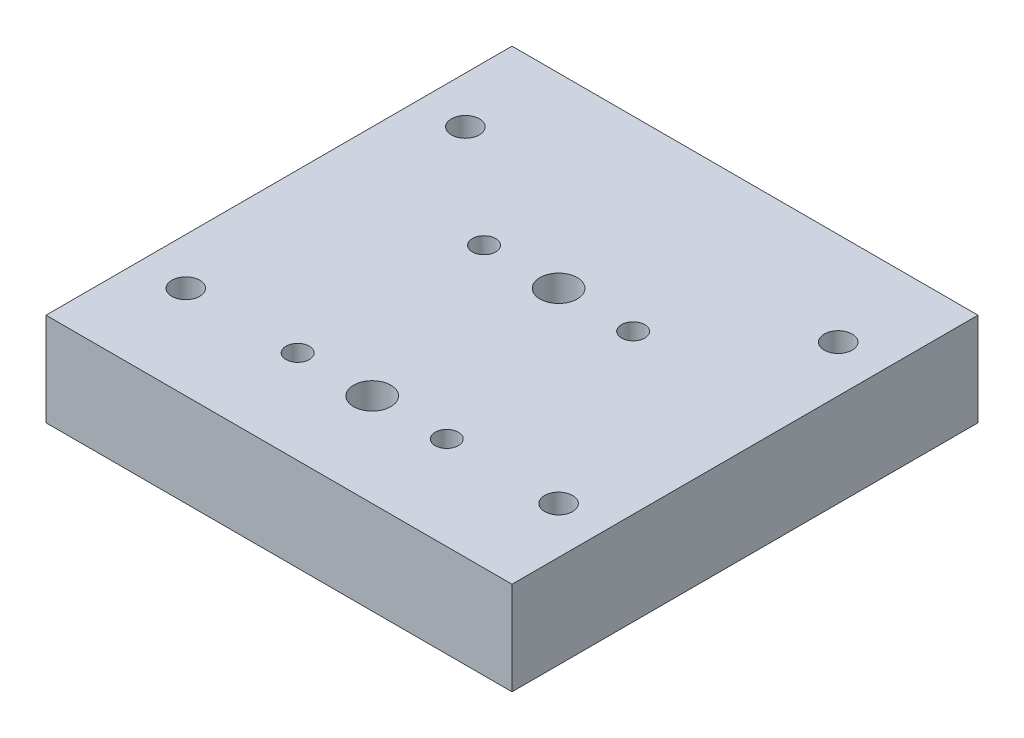
ISO-10303-21;
HEADER;
FILE_DESCRIPTION(('STEP AP214'),'2;1');
FILE_NAME('part.step','',(''),(''),'','','');
FILE_SCHEMA(('AUTOMOTIVE_DESIGN { 1 0 10303 214 1 1 1 1 }'));
ENDSEC;
DATA;
#1=APPLICATION_CONTEXT('core data for automotive mechanical design processes');
#2=APPLICATION_PROTOCOL_DEFINITION('international standard','automotive_design',2000,#1);
#3=PRODUCT_CONTEXT('',#1,'mechanical');
#4=PRODUCT('Part','Part','',(#3));
#5=PRODUCT_RELATED_PRODUCT_CATEGORY('part','',(#4));
#6=PRODUCT_DEFINITION_FORMATION('','',#4);
#7=PRODUCT_DEFINITION_CONTEXT('part definition',#1,'design');
#8=PRODUCT_DEFINITION('design','',#6,#7);
#9=PRODUCT_DEFINITION_SHAPE('','',#8);
#10=(LENGTH_UNIT() NAMED_UNIT(*) SI_UNIT(.MILLI.,.METRE.));
#11=(NAMED_UNIT(*) PLANE_ANGLE_UNIT() SI_UNIT($,.RADIAN.));
#12=(NAMED_UNIT(*) SI_UNIT($,.STERADIAN.) SOLID_ANGLE_UNIT());
#13=UNCERTAINTY_MEASURE_WITH_UNIT(LENGTH_MEASURE(1.E-05),#10,'distance_accuracy_value','');
#14=(GEOMETRIC_REPRESENTATION_CONTEXT(3) GLOBAL_UNCERTAINTY_ASSIGNED_CONTEXT((#13)) GLOBAL_UNIT_ASSIGNED_CONTEXT((#10,
#11,#12)) REPRESENTATION_CONTEXT('',''));
#15=CARTESIAN_POINT('',(0.,0.,0.));
#16=DIRECTION('',(0.,0.,1.));
#17=DIRECTION('',(1.,0.,0.));
#18=AXIS2_PLACEMENT_3D('',#15,#16,#17);
#19=CARTESIAN_POINT('',(0.,20.,0.));
#20=DIRECTION('',(1.,0.,0.));
#21=DIRECTION('',(0.,0.,-1.));
#22=AXIS2_PLACEMENT_3D('',#19,#20,#21);
#23=PLANE('',#22);
#24=DIRECTION('',(0.,0.,1.));
#25=VECTOR('',#24,1.);
#26=CARTESIAN_POINT('',(0.,0.,0.));
#27=LINE('',#26,#25);
#28=CARTESIAN_POINT('',(0.,0.,-100.));
#29=VERTEX_POINT('',#28);
#30=CARTESIAN_POINT('',(0.,0.,0.));
#31=VERTEX_POINT('',#30);
#32=EDGE_CURVE('E98',#29,#31,#27,.T.);
#33=ORIENTED_EDGE('',*,*,#32,.T.);
#34=DIRECTION('',(0.,-1.,0.));
#35=VECTOR('',#34,1.);
#36=CARTESIAN_POINT('',(0.,20.,0.));
#37=LINE('',#36,#35);
#38=CARTESIAN_POINT('',(0.,20.,0.));
#39=VERTEX_POINT('',#38);
#40=EDGE_CURVE('E11',#39,#31,#37,.T.);
#41=ORIENTED_EDGE('',*,*,#40,.F.);
#42=DIRECTION('',(0.,0.,1.));
#43=VECTOR('',#42,1.);
#44=CARTESIAN_POINT('',(0.,20.,0.));
#45=LINE('',#44,#43);
#46=CARTESIAN_POINT('',(0.,20.,-100.));
#47=VERTEX_POINT('',#46);
#48=EDGE_CURVE('E86',#47,#39,#45,.T.);
#49=ORIENTED_EDGE('',*,*,#48,.F.);
#50=DIRECTION('',(0.,-1.,0.));
#51=VECTOR('',#50,1.);
#52=CARTESIAN_POINT('',(0.,20.,-100.));
#53=LINE('',#52,#51);
#54=EDGE_CURVE('E94',#47,#29,#53,.T.);
#55=ORIENTED_EDGE('',*,*,#54,.T.);
#56=EDGE_LOOP('',(#33,#41,#49,#55));
#57=FACE_BOUND('',#56,.T.);
#58=ADVANCED_FACE('F35',(#57),#23,.F.);
#59=CARTESIAN_POINT('',(0.,20.,0.));
#60=DIRECTION('',(0.,0.,-1.));
#61=DIRECTION('',(-1.,0.,0.));
#62=AXIS2_PLACEMENT_3D('',#59,#60,#61);
#63=PLANE('',#62);
#64=DIRECTION('',(1.,0.,0.));
#65=VECTOR('',#64,1.);
#66=CARTESIAN_POINT('',(0.,0.,0.));
#67=LINE('',#66,#65);
#68=CARTESIAN_POINT('',(100.,0.,0.));
#69=VERTEX_POINT('',#68);
#70=EDGE_CURVE('E90',#31,#69,#67,.T.);
#71=ORIENTED_EDGE('',*,*,#70,.T.);
#72=DIRECTION('',(0.,-1.,0.));
#73=VECTOR('',#72,1.);
#74=CARTESIAN_POINT('',(100.,20.,0.));
#75=LINE('',#74,#73);
#76=CARTESIAN_POINT('',(100.,20.,0.));
#77=VERTEX_POINT('',#76);
#78=EDGE_CURVE('E43',#77,#69,#75,.T.);
#79=ORIENTED_EDGE('',*,*,#78,.F.);
#80=DIRECTION('',(1.,0.,0.));
#81=VECTOR('',#80,1.);
#82=CARTESIAN_POINT('',(0.,20.,0.));
#83=LINE('',#82,#81);
#84=EDGE_CURVE('E81',#39,#77,#83,.T.);
#85=ORIENTED_EDGE('',*,*,#84,.F.);
#86=ORIENTED_EDGE('',*,*,#40,.T.);
#87=EDGE_LOOP('',(#71,#79,#85,#86));
#88=FACE_BOUND('',#87,.T.);
#89=ADVANCED_FACE('F89',(#88),#63,.F.);
#90=CARTESIAN_POINT('',(100.,20.,0.));
#91=DIRECTION('',(-1.,0.,0.));
#92=DIRECTION('',(0.,0.,1.));
#93=AXIS2_PLACEMENT_3D('',#90,#91,#92);
#94=PLANE('',#93);
#95=DIRECTION('',(0.,0.,-1.));
#96=VECTOR('',#95,1.);
#97=CARTESIAN_POINT('',(100.,0.,0.));
#98=LINE('',#97,#96);
#99=CARTESIAN_POINT('',(100.,0.,-100.));
#100=VERTEX_POINT('',#99);
#101=EDGE_CURVE('E68',#69,#100,#98,.T.);
#102=ORIENTED_EDGE('',*,*,#101,.T.);
#103=DIRECTION('',(0.,-1.,0.));
#104=VECTOR('',#103,1.);
#105=CARTESIAN_POINT('',(100.,20.,-100.));
#106=LINE('',#105,#104);
#107=CARTESIAN_POINT('',(100.,20.,-100.));
#108=VERTEX_POINT('',#107);
#109=EDGE_CURVE('E91',#108,#100,#106,.T.);
#110=ORIENTED_EDGE('',*,*,#109,.F.);
#111=DIRECTION('',(0.,0.,-1.));
#112=VECTOR('',#111,1.);
#113=CARTESIAN_POINT('',(100.,20.,0.));
#114=LINE('',#113,#112);
#115=EDGE_CURVE('E84',#77,#108,#114,.T.);
#116=ORIENTED_EDGE('',*,*,#115,.F.);
#117=ORIENTED_EDGE('',*,*,#78,.T.);
#118=EDGE_LOOP('',(#102,#110,#116,#117));
#119=FACE_BOUND('',#118,.T.);
#120=ADVANCED_FACE('F92',(#119),#94,.F.);
#121=CARTESIAN_POINT('',(0.,20.,-100.));
#122=DIRECTION('',(0.,0.,1.));
#123=DIRECTION('',(1.,0.,0.));
#124=AXIS2_PLACEMENT_3D('',#121,#122,#123);
#125=PLANE('',#124);
#126=DIRECTION('',(-1.,0.,0.));
#127=VECTOR('',#126,1.);
#128=CARTESIAN_POINT('',(0.,0.,-100.));
#129=LINE('',#128,#127);
#130=EDGE_CURVE('E74',#100,#29,#129,.T.);
#131=ORIENTED_EDGE('',*,*,#130,.T.);
#132=ORIENTED_EDGE('',*,*,#54,.F.);
#133=DIRECTION('',(-1.,0.,0.));
#134=VECTOR('',#133,1.);
#135=CARTESIAN_POINT('',(0.,20.,-100.));
#136=LINE('',#135,#134);
#137=EDGE_CURVE('E51',#108,#47,#136,.T.);
#138=ORIENTED_EDGE('',*,*,#137,.F.);
#139=ORIENTED_EDGE('',*,*,#109,.T.);
#140=EDGE_LOOP('',(#131,#132,#138,#139));
#141=FACE_BOUND('',#140,.T.);
#142=ADVANCED_FACE('F106',(#141),#125,.F.);
#143=CARTESIAN_POINT('',(0.,20.,0.));
#144=DIRECTION('',(0.,-1.,0.));
#145=DIRECTION('',(0.,0.,-1.));
#146=AXIS2_PLACEMENT_3D('',#143,#144,#145);
#147=PLANE('',#146);
#148=CARTESIAN_POINT('',(66.,20.,-20.));
#149=DIRECTION('',(0.,1.,0.));
#150=DIRECTION('',(0.,0.,1.));
#151=AXIS2_PLACEMENT_3D('',#148,#149,#150);
#152=CIRCLE('',#151,2.50000000000001);
#153=CARTESIAN_POINT('',(66.,20.,-17.5));
#154=VERTEX_POINT('',#153);
#155=EDGE_CURVE('E166',#154,#154,#152,.T.);
#156=ORIENTED_EDGE('',*,*,#155,.F.);
#157=EDGE_LOOP('',(#156));
#158=FACE_BOUND('',#157,.T.);
#159=CARTESIAN_POINT('',(34.,20.,-20.));
#160=DIRECTION('',(0.,1.,0.));
#161=DIRECTION('',(0.,0.,1.));
#162=AXIS2_PLACEMENT_3D('',#159,#160,#161);
#163=CIRCLE('',#162,2.5);
#164=CARTESIAN_POINT('',(34.,20.,-17.5));
#165=VERTEX_POINT('',#164);
#166=EDGE_CURVE('E160',#165,#165,#163,.T.);
#167=ORIENTED_EDGE('',*,*,#166,.F.);
#168=EDGE_LOOP('',(#167));
#169=FACE_BOUND('',#168,.T.);
#170=CARTESIAN_POINT('',(66.,20.,-60.));
#171=DIRECTION('',(0.,1.,0.));
#172=DIRECTION('',(0.,0.,1.));
#173=AXIS2_PLACEMENT_3D('',#170,#171,#172);
#174=CIRCLE('',#173,2.5);
#175=CARTESIAN_POINT('',(66.,20.,-57.5));
#176=VERTEX_POINT('',#175);
#177=EDGE_CURVE('E154',#176,#176,#174,.T.);
#178=ORIENTED_EDGE('',*,*,#177,.F.);
#179=EDGE_LOOP('',(#178));
#180=FACE_BOUND('',#179,.T.);
#181=CARTESIAN_POINT('',(34.,20.,-60.));
#182=DIRECTION('',(0.,1.,0.));
#183=DIRECTION('',(0.,0.,1.));
#184=AXIS2_PLACEMENT_3D('',#181,#182,#183);
#185=CIRCLE('',#184,2.5);
#186=CARTESIAN_POINT('',(34.,20.,-57.5));
#187=VERTEX_POINT('',#186);
#188=EDGE_CURVE('E148',#187,#187,#185,.T.);
#189=ORIENTED_EDGE('',*,*,#188,.F.);
#190=EDGE_LOOP('',(#189));
#191=FACE_BOUND('',#190,.T.);
#192=CARTESIAN_POINT('',(90.,20.,-20.));
#193=DIRECTION('',(0.,1.,0.));
#194=DIRECTION('',(0.,0.,1.));
#195=AXIS2_PLACEMENT_3D('',#192,#193,#194);
#196=CIRCLE('',#195,3.00000000000001);
#197=CARTESIAN_POINT('',(90.,20.,-17.));
#198=VERTEX_POINT('',#197);
#199=EDGE_CURVE('E142',#198,#198,#196,.T.);
#200=ORIENTED_EDGE('',*,*,#199,.F.);
#201=EDGE_LOOP('',(#200));
#202=FACE_BOUND('',#201,.T.);
#203=CARTESIAN_POINT('',(50.,20.,-60.));
#204=DIRECTION('',(0.,1.,0.));
#205=DIRECTION('',(0.,0.,1.));
#206=AXIS2_PLACEMENT_3D('',#203,#204,#205);
#207=CIRCLE('',#206,4.00000000000001);
#208=CARTESIAN_POINT('',(50.,20.,-56.));
#209=VERTEX_POINT('',#208);
#210=EDGE_CURVE('E136',#209,#209,#207,.T.);
#211=ORIENTED_EDGE('',*,*,#210,.F.);
#212=EDGE_LOOP('',(#211));
#213=FACE_BOUND('',#212,.T.);
#214=CARTESIAN_POINT('',(10.,20.,-20.));
#215=DIRECTION('',(0.,1.,0.));
#216=DIRECTION('',(0.,0.,1.));
#217=AXIS2_PLACEMENT_3D('',#214,#215,#216);
#218=CIRCLE('',#217,3.);
#219=CARTESIAN_POINT('',(10.,20.,-17.));
#220=VERTEX_POINT('',#219);
#221=EDGE_CURVE('E130',#220,#220,#218,.T.);
#222=ORIENTED_EDGE('',*,*,#221,.F.);
#223=EDGE_LOOP('',(#222));
#224=FACE_BOUND('',#223,.T.);
#225=CARTESIAN_POINT('',(50.,20.,-20.));
#226=DIRECTION('',(0.,1.,0.));
#227=DIRECTION('',(0.,0.,1.));
#228=AXIS2_PLACEMENT_3D('',#225,#226,#227);
#229=CIRCLE('',#228,4.00000000000001);
#230=CARTESIAN_POINT('',(50.,20.,-16.));
#231=VERTEX_POINT('',#230);
#232=EDGE_CURVE('E124',#231,#231,#229,.T.);
#233=ORIENTED_EDGE('',*,*,#232,.F.);
#234=EDGE_LOOP('',(#233));
#235=FACE_BOUND('',#234,.T.);
#236=CARTESIAN_POINT('',(90.,20.,-80.));
#237=DIRECTION('',(0.,1.,0.));
#238=DIRECTION('',(0.,0.,1.));
#239=AXIS2_PLACEMENT_3D('',#236,#237,#238);
#240=CIRCLE('',#239,3.00000000000001);
#241=CARTESIAN_POINT('',(90.,20.,-77.));
#242=VERTEX_POINT('',#241);
#243=EDGE_CURVE('E118',#242,#242,#240,.T.);
#244=ORIENTED_EDGE('',*,*,#243,.F.);
#245=EDGE_LOOP('',(#244));
#246=FACE_BOUND('',#245,.T.);
#247=CARTESIAN_POINT('',(9.99999999999999,20.,-80.));
#248=DIRECTION('',(0.,1.,0.));
#249=DIRECTION('',(0.,0.,1.));
#250=AXIS2_PLACEMENT_3D('',#247,#248,#249);
#251=CIRCLE('',#250,3.);
#252=CARTESIAN_POINT('',(9.99999999999999,20.,-77.));
#253=VERTEX_POINT('',#252);
#254=EDGE_CURVE('E112',#253,#253,#251,.T.);
#255=ORIENTED_EDGE('',*,*,#254,.F.);
#256=EDGE_LOOP('',(#255));
#257=FACE_BOUND('',#256,.T.);
#258=ORIENTED_EDGE('',*,*,#48,.T.);
#259=ORIENTED_EDGE('',*,*,#84,.T.);
#260=ORIENTED_EDGE('',*,*,#115,.T.);
#261=ORIENTED_EDGE('',*,*,#137,.T.);
#262=EDGE_LOOP('',(#258,#259,#260,#261));
#263=FACE_BOUND('',#262,.T.);
#264=ADVANCED_FACE('F82',(#158,#169,#180,#191,#202,#213,#224,#235,#246,#257,#263),#147,.F.);
#265=CARTESIAN_POINT('',(0.,0.,0.));
#266=DIRECTION('',(0.,-1.,0.));
#267=DIRECTION('',(0.,0.,-1.));
#268=AXIS2_PLACEMENT_3D('',#265,#266,#267);
#269=PLANE('',#268);
#270=CARTESIAN_POINT('',(66.,0.,-20.));
#271=DIRECTION('',(0.,1.,0.));
#272=DIRECTION('',(0.,0.,1.));
#273=AXIS2_PLACEMENT_3D('',#270,#271,#272);
#274=CIRCLE('',#273,2.50000000000001);
#275=CARTESIAN_POINT('',(66.,0.,-17.5));
#276=VERTEX_POINT('',#275);
#277=EDGE_CURVE('E163',#276,#276,#274,.T.);
#278=ORIENTED_EDGE('',*,*,#277,.T.);
#279=EDGE_LOOP('',(#278));
#280=FACE_BOUND('',#279,.T.);
#281=CARTESIAN_POINT('',(34.,0.,-20.));
#282=DIRECTION('',(0.,1.,0.));
#283=DIRECTION('',(0.,0.,1.));
#284=AXIS2_PLACEMENT_3D('',#281,#282,#283);
#285=CIRCLE('',#284,2.5);
#286=CARTESIAN_POINT('',(34.,0.,-17.5));
#287=VERTEX_POINT('',#286);
#288=EDGE_CURVE('E157',#287,#287,#285,.T.);
#289=ORIENTED_EDGE('',*,*,#288,.T.);
#290=EDGE_LOOP('',(#289));
#291=FACE_BOUND('',#290,.T.);
#292=CARTESIAN_POINT('',(66.,0.,-60.));
#293=DIRECTION('',(0.,1.,0.));
#294=DIRECTION('',(0.,0.,1.));
#295=AXIS2_PLACEMENT_3D('',#292,#293,#294);
#296=CIRCLE('',#295,2.5);
#297=CARTESIAN_POINT('',(66.,0.,-57.5));
#298=VERTEX_POINT('',#297);
#299=EDGE_CURVE('E151',#298,#298,#296,.T.);
#300=ORIENTED_EDGE('',*,*,#299,.T.);
#301=EDGE_LOOP('',(#300));
#302=FACE_BOUND('',#301,.T.);
#303=CARTESIAN_POINT('',(34.,0.,-60.));
#304=DIRECTION('',(0.,1.,0.));
#305=DIRECTION('',(0.,0.,1.));
#306=AXIS2_PLACEMENT_3D('',#303,#304,#305);
#307=CIRCLE('',#306,2.5);
#308=CARTESIAN_POINT('',(34.,0.,-57.5));
#309=VERTEX_POINT('',#308);
#310=EDGE_CURVE('E145',#309,#309,#307,.T.);
#311=ORIENTED_EDGE('',*,*,#310,.T.);
#312=EDGE_LOOP('',(#311));
#313=FACE_BOUND('',#312,.T.);
#314=CARTESIAN_POINT('',(90.,0.,-20.));
#315=DIRECTION('',(0.,1.,0.));
#316=DIRECTION('',(0.,0.,1.));
#317=AXIS2_PLACEMENT_3D('',#314,#315,#316);
#318=CIRCLE('',#317,3.00000000000001);
#319=CARTESIAN_POINT('',(90.,0.,-17.));
#320=VERTEX_POINT('',#319);
#321=EDGE_CURVE('E139',#320,#320,#318,.T.);
#322=ORIENTED_EDGE('',*,*,#321,.T.);
#323=EDGE_LOOP('',(#322));
#324=FACE_BOUND('',#323,.T.);
#325=CARTESIAN_POINT('',(50.,0.,-60.));
#326=DIRECTION('',(0.,1.,0.));
#327=DIRECTION('',(0.,0.,1.));
#328=AXIS2_PLACEMENT_3D('',#325,#326,#327);
#329=CIRCLE('',#328,4.00000000000001);
#330=CARTESIAN_POINT('',(50.,0.,-56.));
#331=VERTEX_POINT('',#330);
#332=EDGE_CURVE('E133',#331,#331,#329,.T.);
#333=ORIENTED_EDGE('',*,*,#332,.T.);
#334=EDGE_LOOP('',(#333));
#335=FACE_BOUND('',#334,.T.);
#336=CARTESIAN_POINT('',(10.,0.,-20.));
#337=DIRECTION('',(0.,1.,0.));
#338=DIRECTION('',(0.,0.,1.));
#339=AXIS2_PLACEMENT_3D('',#336,#337,#338);
#340=CIRCLE('',#339,3.);
#341=CARTESIAN_POINT('',(10.,0.,-17.));
#342=VERTEX_POINT('',#341);
#343=EDGE_CURVE('E127',#342,#342,#340,.T.);
#344=ORIENTED_EDGE('',*,*,#343,.T.);
#345=EDGE_LOOP('',(#344));
#346=FACE_BOUND('',#345,.T.);
#347=CARTESIAN_POINT('',(50.,0.,-20.));
#348=DIRECTION('',(0.,1.,0.));
#349=DIRECTION('',(0.,0.,1.));
#350=AXIS2_PLACEMENT_3D('',#347,#348,#349);
#351=CIRCLE('',#350,4.00000000000001);
#352=CARTESIAN_POINT('',(50.,0.,-16.));
#353=VERTEX_POINT('',#352);
#354=EDGE_CURVE('E121',#353,#353,#351,.T.);
#355=ORIENTED_EDGE('',*,*,#354,.T.);
#356=EDGE_LOOP('',(#355));
#357=FACE_BOUND('',#356,.T.);
#358=CARTESIAN_POINT('',(90.,0.,-80.));
#359=DIRECTION('',(0.,1.,0.));
#360=DIRECTION('',(0.,0.,1.));
#361=AXIS2_PLACEMENT_3D('',#358,#359,#360);
#362=CIRCLE('',#361,3.00000000000001);
#363=CARTESIAN_POINT('',(90.,0.,-77.));
#364=VERTEX_POINT('',#363);
#365=EDGE_CURVE('E115',#364,#364,#362,.T.);
#366=ORIENTED_EDGE('',*,*,#365,.T.);
#367=EDGE_LOOP('',(#366));
#368=FACE_BOUND('',#367,.T.);
#369=CARTESIAN_POINT('',(9.99999999999999,0.,-80.));
#370=DIRECTION('',(0.,1.,0.));
#371=DIRECTION('',(0.,0.,1.));
#372=AXIS2_PLACEMENT_3D('',#369,#370,#371);
#373=CIRCLE('',#372,3.);
#374=CARTESIAN_POINT('',(9.99999999999999,0.,-77.));
#375=VERTEX_POINT('',#374);
#376=EDGE_CURVE('E101',#375,#375,#373,.T.);
#377=ORIENTED_EDGE('',*,*,#376,.T.);
#378=EDGE_LOOP('',(#377));
#379=FACE_BOUND('',#378,.T.);
#380=ORIENTED_EDGE('',*,*,#32,.F.);
#381=ORIENTED_EDGE('',*,*,#130,.F.);
#382=ORIENTED_EDGE('',*,*,#101,.F.);
#383=ORIENTED_EDGE('',*,*,#70,.F.);
#384=EDGE_LOOP('',(#380,#381,#382,#383));
#385=FACE_BOUND('',#384,.T.);
#386=ADVANCED_FACE('F109',(#280,#291,#302,#313,#324,#335,#346,#357,#368,#379,#385),#269,.T.);
#387=CARTESIAN_POINT('',(9.99999999999999,0.,-80.));
#388=DIRECTION('',(0.,1.,0.));
#389=DIRECTION('',(0.,0.,1.));
#390=AXIS2_PLACEMENT_3D('',#387,#388,#389);
#391=CYLINDRICAL_SURFACE('',#390,3.);
#392=ORIENTED_EDGE('',*,*,#376,.F.);
#393=EDGE_LOOP('',(#392));
#394=FACE_BOUND('',#393,.T.);
#395=ORIENTED_EDGE('',*,*,#254,.T.);
#396=EDGE_LOOP('',(#395));
#397=FACE_BOUND('',#396,.T.);
#398=ADVANCED_FACE('F202',(#394,#397),#391,.F.);
#399=CARTESIAN_POINT('',(90.,0.,-80.));
#400=DIRECTION('',(0.,1.,0.));
#401=DIRECTION('',(0.,0.,1.));
#402=AXIS2_PLACEMENT_3D('',#399,#400,#401);
#403=CYLINDRICAL_SURFACE('',#402,3.00000000000001);
#404=ORIENTED_EDGE('',*,*,#365,.F.);
#405=EDGE_LOOP('',(#404));
#406=FACE_BOUND('',#405,.T.);
#407=ORIENTED_EDGE('',*,*,#243,.T.);
#408=EDGE_LOOP('',(#407));
#409=FACE_BOUND('',#408,.T.);
#410=ADVANCED_FACE('F204',(#406,#409),#403,.F.);
#411=CARTESIAN_POINT('',(50.,0.,-20.));
#412=DIRECTION('',(0.,1.,0.));
#413=DIRECTION('',(0.,0.,1.));
#414=AXIS2_PLACEMENT_3D('',#411,#412,#413);
#415=CYLINDRICAL_SURFACE('',#414,4.00000000000001);
#416=ORIENTED_EDGE('',*,*,#354,.F.);
#417=EDGE_LOOP('',(#416));
#418=FACE_BOUND('',#417,.T.);
#419=ORIENTED_EDGE('',*,*,#232,.T.);
#420=EDGE_LOOP('',(#419));
#421=FACE_BOUND('',#420,.T.);
#422=ADVANCED_FACE('F211',(#418,#421),#415,.F.);
#423=CARTESIAN_POINT('',(10.,0.,-20.));
#424=DIRECTION('',(0.,1.,0.));
#425=DIRECTION('',(0.,0.,1.));
#426=AXIS2_PLACEMENT_3D('',#423,#424,#425);
#427=CYLINDRICAL_SURFACE('',#426,3.);
#428=ORIENTED_EDGE('',*,*,#343,.F.);
#429=EDGE_LOOP('',(#428));
#430=FACE_BOUND('',#429,.T.);
#431=ORIENTED_EDGE('',*,*,#221,.T.);
#432=EDGE_LOOP('',(#431));
#433=FACE_BOUND('',#432,.T.);
#434=ADVANCED_FACE('F257',(#430,#433),#427,.F.);
#435=CARTESIAN_POINT('',(50.,0.,-60.));
#436=DIRECTION('',(0.,1.,0.));
#437=DIRECTION('',(0.,0.,1.));
#438=AXIS2_PLACEMENT_3D('',#435,#436,#437);
#439=CYLINDRICAL_SURFACE('',#438,4.00000000000001);
#440=ORIENTED_EDGE('',*,*,#332,.F.);
#441=EDGE_LOOP('',(#440));
#442=FACE_BOUND('',#441,.T.);
#443=ORIENTED_EDGE('',*,*,#210,.T.);
#444=EDGE_LOOP('',(#443));
#445=FACE_BOUND('',#444,.T.);
#446=ADVANCED_FACE('F267',(#442,#445),#439,.F.);
#447=CARTESIAN_POINT('',(90.,0.,-20.));
#448=DIRECTION('',(0.,1.,0.));
#449=DIRECTION('',(0.,0.,1.));
#450=AXIS2_PLACEMENT_3D('',#447,#448,#449);
#451=CYLINDRICAL_SURFACE('',#450,3.00000000000001);
#452=ORIENTED_EDGE('',*,*,#321,.F.);
#453=EDGE_LOOP('',(#452));
#454=FACE_BOUND('',#453,.T.);
#455=ORIENTED_EDGE('',*,*,#199,.T.);
#456=EDGE_LOOP('',(#455));
#457=FACE_BOUND('',#456,.T.);
#458=ADVANCED_FACE('F277',(#454,#457),#451,.F.);
#459=CARTESIAN_POINT('',(34.,0.,-60.));
#460=DIRECTION('',(0.,1.,0.));
#461=DIRECTION('',(0.,0.,1.));
#462=AXIS2_PLACEMENT_3D('',#459,#460,#461);
#463=CYLINDRICAL_SURFACE('',#462,2.5);
#464=ORIENTED_EDGE('',*,*,#310,.F.);
#465=EDGE_LOOP('',(#464));
#466=FACE_BOUND('',#465,.T.);
#467=ORIENTED_EDGE('',*,*,#188,.T.);
#468=EDGE_LOOP('',(#467));
#469=FACE_BOUND('',#468,.T.);
#470=ADVANCED_FACE('F287',(#466,#469),#463,.F.);
#471=CARTESIAN_POINT('',(66.,0.,-60.));
#472=DIRECTION('',(0.,1.,0.));
#473=DIRECTION('',(0.,0.,1.));
#474=AXIS2_PLACEMENT_3D('',#471,#472,#473);
#475=CYLINDRICAL_SURFACE('',#474,2.5);
#476=ORIENTED_EDGE('',*,*,#299,.F.);
#477=EDGE_LOOP('',(#476));
#478=FACE_BOUND('',#477,.T.);
#479=ORIENTED_EDGE('',*,*,#177,.T.);
#480=EDGE_LOOP('',(#479));
#481=FACE_BOUND('',#480,.T.);
#482=ADVANCED_FACE('F297',(#478,#481),#475,.F.);
#483=CARTESIAN_POINT('',(34.,0.,-20.));
#484=DIRECTION('',(0.,1.,0.));
#485=DIRECTION('',(0.,0.,1.));
#486=AXIS2_PLACEMENT_3D('',#483,#484,#485);
#487=CYLINDRICAL_SURFACE('',#486,2.5);
#488=ORIENTED_EDGE('',*,*,#288,.F.);
#489=EDGE_LOOP('',(#488));
#490=FACE_BOUND('',#489,.T.);
#491=ORIENTED_EDGE('',*,*,#166,.T.);
#492=EDGE_LOOP('',(#491));
#493=FACE_BOUND('',#492,.T.);
#494=ADVANCED_FACE('F177',(#490,#493),#487,.F.);
#495=CARTESIAN_POINT('',(66.,0.,-20.));
#496=DIRECTION('',(0.,1.,0.));
#497=DIRECTION('',(0.,0.,1.));
#498=AXIS2_PLACEMENT_3D('',#495,#496,#497);
#499=CYLINDRICAL_SURFACE('',#498,2.50000000000001);
#500=ORIENTED_EDGE('',*,*,#277,.F.);
#501=EDGE_LOOP('',(#500));
#502=FACE_BOUND('',#501,.T.);
#503=ORIENTED_EDGE('',*,*,#155,.T.);
#504=EDGE_LOOP('',(#503));
#505=FACE_BOUND('',#504,.T.);
#506=ADVANCED_FACE('F174',(#502,#505),#499,.F.);
#507=CLOSED_SHELL('',(#58,#89,#120,#142,#264,#386,#398,#410,#422,#434,#446,#458,#470,#482,#494,#506));
#508=MANIFOLD_SOLID_BREP('B2',#507);
#509=ADVANCED_BREP_SHAPE_REPRESENTATION('',(#18,#508),#14);
#510=SHAPE_DEFINITION_REPRESENTATION(#9,#509);
ENDSEC;
END-ISO-10303-21;
